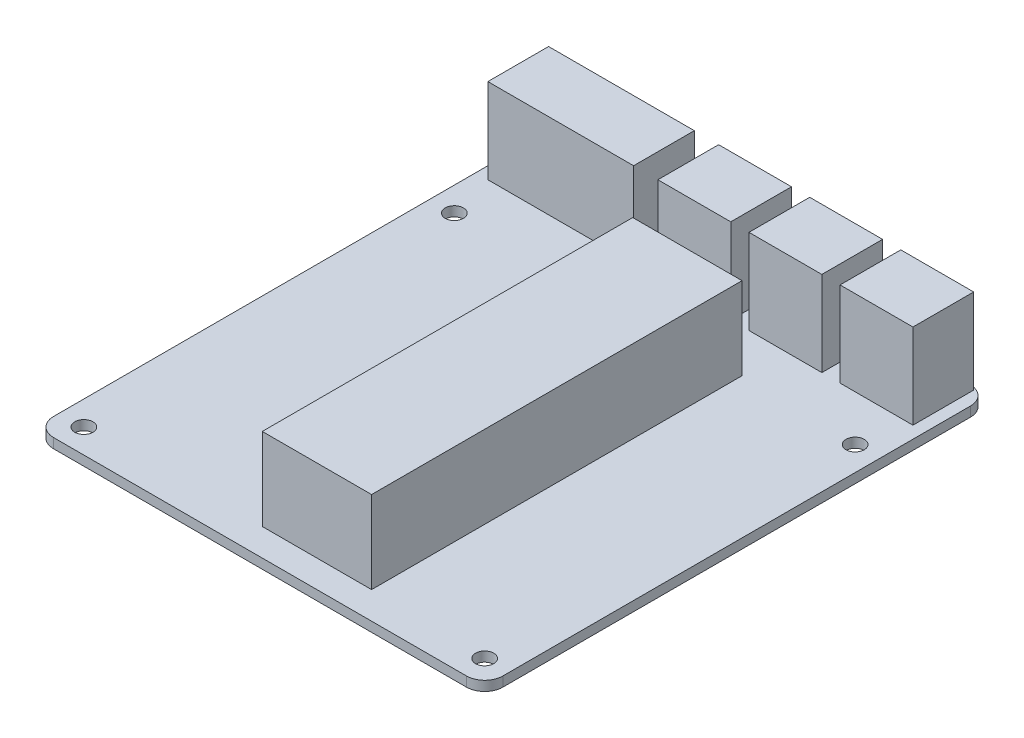
ISO-10303-21;
HEADER;
FILE_DESCRIPTION(('STEP AP214'),'2;1');
FILE_NAME('part.step','',(''),(''),'','','');
FILE_SCHEMA(('AUTOMOTIVE_DESIGN { 1 0 10303 214 1 1 1 1 }'));
ENDSEC;
DATA;
#1=APPLICATION_CONTEXT('core data for automotive mechanical design processes');
#2=APPLICATION_PROTOCOL_DEFINITION('international standard','automotive_design',2000,#1);
#3=PRODUCT_CONTEXT('',#1,'mechanical');
#4=PRODUCT('Part','Part','',(#3));
#5=PRODUCT_RELATED_PRODUCT_CATEGORY('part','',(#4));
#6=PRODUCT_DEFINITION_FORMATION('','',#4);
#7=PRODUCT_DEFINITION_CONTEXT('part definition',#1,'design');
#8=PRODUCT_DEFINITION('design','',#6,#7);
#9=PRODUCT_DEFINITION_SHAPE('','',#8);
#10=(LENGTH_UNIT() NAMED_UNIT(*) SI_UNIT(.MILLI.,.METRE.));
#11=(NAMED_UNIT(*) PLANE_ANGLE_UNIT() SI_UNIT($,.RADIAN.));
#12=(NAMED_UNIT(*) SI_UNIT($,.STERADIAN.) SOLID_ANGLE_UNIT());
#13=UNCERTAINTY_MEASURE_WITH_UNIT(LENGTH_MEASURE(1.E-05),#10,'distance_accuracy_value','');
#14=(GEOMETRIC_REPRESENTATION_CONTEXT(3) GLOBAL_UNCERTAINTY_ASSIGNED_CONTEXT((#13)) GLOBAL_UNIT_ASSIGNED_CONTEXT((#10,
#11,#12)) REPRESENTATION_CONTEXT('',''));
#15=CARTESIAN_POINT('',(0.,0.,0.));
#16=DIRECTION('',(0.,0.,1.));
#17=DIRECTION('',(1.,0.,0.));
#18=AXIS2_PLACEMENT_3D('',#15,#16,#17);
#19=CARTESIAN_POINT('',(-34.,1.6,-38.5));
#20=DIRECTION('',(0.,1.,0.));
#21=DIRECTION('',(0.,0.,1.));
#22=AXIS2_PLACEMENT_3D('',#19,#20,#21);
#23=PLANE('',#22);
#24=CARTESIAN_POINT('',(33.,1.6,-23.5));
#25=DIRECTION('',(0.,1.,0.));
#26=DIRECTION('',(0.,0.,1.));
#27=AXIS2_PLACEMENT_3D('',#24,#25,#26);
#28=CIRCLE('',#27,1.5);
#29=CARTESIAN_POINT('',(33.,1.6,-22.));
#30=VERTEX_POINT('',#29);
#31=EDGE_CURVE('E385',#30,#30,#28,.T.);
#32=ORIENTED_EDGE('',*,*,#31,.F.);
#33=EDGE_LOOP('',(#32));
#34=FACE_BOUND('',#33,.T.);
#35=CARTESIAN_POINT('',(-33.,1.6,37.5));
#36=DIRECTION('',(0.,1.,0.));
#37=DIRECTION('',(0.,0.,1.));
#38=AXIS2_PLACEMENT_3D('',#35,#36,#37);
#39=CIRCLE('',#38,1.5);
#40=CARTESIAN_POINT('',(-33.,1.6,39.));
#41=VERTEX_POINT('',#40);
#42=EDGE_CURVE('E382',#41,#41,#39,.T.);
#43=ORIENTED_EDGE('',*,*,#42,.F.);
#44=EDGE_LOOP('',(#43));
#45=FACE_BOUND('',#44,.T.);
#46=CARTESIAN_POINT('',(33.,1.6,37.5));
#47=DIRECTION('',(0.,1.,0.));
#48=DIRECTION('',(0.,0.,1.));
#49=AXIS2_PLACEMENT_3D('',#46,#47,#48);
#50=CIRCLE('',#49,1.5);
#51=CARTESIAN_POINT('',(33.,1.6,39.));
#52=VERTEX_POINT('',#51);
#53=EDGE_CURVE('E379',#52,#52,#50,.T.);
#54=ORIENTED_EDGE('',*,*,#53,.F.);
#55=EDGE_LOOP('',(#54));
#56=FACE_BOUND('',#55,.T.);
#57=CARTESIAN_POINT('',(-33.,1.6,-23.5));
#58=DIRECTION('',(0.,1.,0.));
#59=DIRECTION('',(0.,0.,1.));
#60=AXIS2_PLACEMENT_3D('',#57,#58,#59);
#61=CIRCLE('',#60,1.5);
#62=CARTESIAN_POINT('',(-33.,1.6,-22.));
#63=VERTEX_POINT('',#62);
#64=EDGE_CURVE('E376',#63,#63,#61,.T.);
#65=ORIENTED_EDGE('',*,*,#64,.F.);
#66=EDGE_LOOP('',(#65));
#67=FACE_BOUND('',#66,.T.);
#68=CARTESIAN_POINT('',(-34.,1.6,-38.5));
#69=DIRECTION('',(0.,1.,0.));
#70=DIRECTION('',(0.,0.,1.));
#71=AXIS2_PLACEMENT_3D('',#68,#69,#70);
#72=CIRCLE('',#71,3.);
#73=CARTESIAN_POINT('',(-34.,1.6,-41.5));
#74=VERTEX_POINT('',#73);
#75=CARTESIAN_POINT('',(-37.,1.6,-38.5));
#76=VERTEX_POINT('',#75);
#77=EDGE_CURVE('E389',#74,#76,#72,.T.);
#78=ORIENTED_EDGE('',*,*,#77,.T.);
#79=DIRECTION('',(0.,0.,1.));
#80=VECTOR('',#79,1.);
#81=CARTESIAN_POINT('',(-37.,1.6,-38.5));
#82=LINE('',#81,#80);
#83=CARTESIAN_POINT('',(-37.,1.6,38.5));
#84=VERTEX_POINT('',#83);
#85=EDGE_CURVE('E392',#76,#84,#82,.T.);
#86=ORIENTED_EDGE('',*,*,#85,.T.);
#87=CARTESIAN_POINT('',(-34.,1.6,38.5));
#88=DIRECTION('',(0.,1.,0.));
#89=DIRECTION('',(0.,0.,-1.));
#90=AXIS2_PLACEMENT_3D('',#87,#88,#89);
#91=CIRCLE('',#90,3.);
#92=CARTESIAN_POINT('',(-34.,1.6,41.5));
#93=VERTEX_POINT('',#92);
#94=EDGE_CURVE('E395',#84,#93,#91,.T.);
#95=ORIENTED_EDGE('',*,*,#94,.T.);
#96=DIRECTION('',(1.,0.,0.));
#97=VECTOR('',#96,1.);
#98=CARTESIAN_POINT('',(34.,1.6,41.5));
#99=LINE('',#98,#97);
#100=CARTESIAN_POINT('',(34.,1.6,41.5));
#101=VERTEX_POINT('',#100);
#102=EDGE_CURVE('E397',#93,#101,#99,.T.);
#103=ORIENTED_EDGE('',*,*,#102,.T.);
#104=CARTESIAN_POINT('',(34.,1.6,38.5));
#105=DIRECTION('',(0.,1.,0.));
#106=DIRECTION('',(0.,0.,-1.));
#107=AXIS2_PLACEMENT_3D('',#104,#105,#106);
#108=CIRCLE('',#107,3.);
#109=CARTESIAN_POINT('',(37.,1.6,38.5));
#110=VERTEX_POINT('',#109);
#111=EDGE_CURVE('E399',#101,#110,#108,.T.);
#112=ORIENTED_EDGE('',*,*,#111,.T.);
#113=DIRECTION('',(0.,0.,-1.));
#114=VECTOR('',#113,1.);
#115=CARTESIAN_POINT('',(37.,1.6,-38.5));
#116=LINE('',#115,#114);
#117=CARTESIAN_POINT('',(37.,1.6,-38.5));
#118=VERTEX_POINT('',#117);
#119=EDGE_CURVE('E401',#110,#118,#116,.T.);
#120=ORIENTED_EDGE('',*,*,#119,.T.);
#121=CARTESIAN_POINT('',(34.,1.6,-38.5));
#122=DIRECTION('',(0.,1.,0.));
#123=DIRECTION('',(0.,0.,-1.));
#124=AXIS2_PLACEMENT_3D('',#121,#122,#123);
#125=CIRCLE('',#124,3.);
#126=CARTESIAN_POINT('',(34.,1.6,-41.5));
#127=VERTEX_POINT('',#126);
#128=EDGE_CURVE('E403',#118,#127,#125,.T.);
#129=ORIENTED_EDGE('',*,*,#128,.T.);
#130=DIRECTION('',(-1.,0.,0.));
#131=VECTOR('',#130,1.);
#132=CARTESIAN_POINT('',(34.,1.6,-41.5));
#133=LINE('',#132,#131);
#134=EDGE_CURVE('E405',#127,#74,#133,.T.);
#135=ORIENTED_EDGE('',*,*,#134,.T.);
#136=EDGE_LOOP('',(#78,#86,#95,#103,#112,#120,#129,#135));
#137=FACE_BOUND('',#136,.T.);
#138=DIRECTION('',(1.,0.,0.));
#139=VECTOR('',#138,1.);
#140=CARTESIAN_POINT('',(-11.,1.6,-31.0223671871747));
#141=LINE('',#140,#139);
#142=CARTESIAN_POINT('',(-35.,1.6,-31.0223671871747));
#143=VERTEX_POINT('',#142);
#144=CARTESIAN_POINT('',(-11.,1.6,-31.0223671871747));
#145=VERTEX_POINT('',#144);
#146=EDGE_CURVE('E349',#143,#145,#141,.T.);
#147=ORIENTED_EDGE('',*,*,#146,.F.);
#148=DIRECTION('',(0.,0.,1.));
#149=VECTOR('',#148,1.);
#150=CARTESIAN_POINT('',(-35.,1.6,-41.0223671871747));
#151=LINE('',#150,#149);
#152=CARTESIAN_POINT('',(-35.,1.6,-41.0223671871747));
#153=VERTEX_POINT('',#152);
#154=EDGE_CURVE('E335',#153,#143,#151,.T.);
#155=ORIENTED_EDGE('',*,*,#154,.F.);
#156=DIRECTION('',(-1.,0.,0.));
#157=VECTOR('',#156,1.);
#158=CARTESIAN_POINT('',(-11.,1.6,-41.0223671871747));
#159=LINE('',#158,#157);
#160=CARTESIAN_POINT('',(-11.,1.6,-41.0223671871747));
#161=VERTEX_POINT('',#160);
#162=EDGE_CURVE('E340',#161,#153,#159,.T.);
#163=ORIENTED_EDGE('',*,*,#162,.F.);
#164=DIRECTION('',(0.,0.,-1.));
#165=VECTOR('',#164,1.);
#166=CARTESIAN_POINT('',(-11.,1.6,-41.0223671871747));
#167=LINE('',#166,#165);
#168=EDGE_CURVE('E351',#145,#161,#167,.T.);
#169=ORIENTED_EDGE('',*,*,#168,.F.);
#170=EDGE_LOOP('',(#147,#155,#163,#169));
#171=FACE_BOUND('',#170,.T.);
#172=DIRECTION('',(1.,0.,0.));
#173=VECTOR('',#172,1.);
#174=CARTESIAN_POINT('',(5.,1.6,-31.0223671871747));
#175=LINE('',#174,#173);
#176=CARTESIAN_POINT('',(-7.,1.6,-31.0223671871747));
#177=VERTEX_POINT('',#176);
#178=CARTESIAN_POINT('',(5.,1.6,-31.0223671871747));
#179=VERTEX_POINT('',#178);
#180=EDGE_CURVE('E320',#177,#179,#175,.T.);
#181=ORIENTED_EDGE('',*,*,#180,.F.);
#182=DIRECTION('',(0.,0.,1.));
#183=VECTOR('',#182,1.);
#184=CARTESIAN_POINT('',(-7.,1.6,-41.0223671871747));
#185=LINE('',#184,#183);
#186=CARTESIAN_POINT('',(-7.,1.6,-41.0223671871747));
#187=VERTEX_POINT('',#186);
#188=EDGE_CURVE('E306',#187,#177,#185,.T.);
#189=ORIENTED_EDGE('',*,*,#188,.F.);
#190=DIRECTION('',(-1.,0.,0.));
#191=VECTOR('',#190,1.);
#192=CARTESIAN_POINT('',(5.,1.6,-41.0223671871747));
#193=LINE('',#192,#191);
#194=CARTESIAN_POINT('',(5.,1.6,-41.0223671871747));
#195=VERTEX_POINT('',#194);
#196=EDGE_CURVE('E311',#195,#187,#193,.T.);
#197=ORIENTED_EDGE('',*,*,#196,.F.);
#198=DIRECTION('',(0.,0.,-1.));
#199=VECTOR('',#198,1.);
#200=CARTESIAN_POINT('',(5.,1.6,-41.0223671871747));
#201=LINE('',#200,#199);
#202=EDGE_CURVE('E322',#179,#195,#201,.T.);
#203=ORIENTED_EDGE('',*,*,#202,.F.);
#204=EDGE_LOOP('',(#181,#189,#197,#203));
#205=FACE_BOUND('',#204,.T.);
#206=DIRECTION('',(1.,0.,0.));
#207=VECTOR('',#206,1.);
#208=CARTESIAN_POINT('',(20.,1.6,-31.0223671871747));
#209=LINE('',#208,#207);
#210=CARTESIAN_POINT('',(8.,1.6,-31.0223671871747));
#211=VERTEX_POINT('',#210);
#212=CARTESIAN_POINT('',(20.,1.6,-31.0223671871747));
#213=VERTEX_POINT('',#212);
#214=EDGE_CURVE('E291',#211,#213,#209,.T.);
#215=ORIENTED_EDGE('',*,*,#214,.F.);
#216=DIRECTION('',(0.,0.,1.));
#217=VECTOR('',#216,1.);
#218=CARTESIAN_POINT('',(8.,1.6,-41.0223671871747));
#219=LINE('',#218,#217);
#220=CARTESIAN_POINT('',(8.,1.6,-41.0223671871747));
#221=VERTEX_POINT('',#220);
#222=EDGE_CURVE('E277',#221,#211,#219,.T.);
#223=ORIENTED_EDGE('',*,*,#222,.F.);
#224=DIRECTION('',(-1.,0.,0.));
#225=VECTOR('',#224,1.);
#226=CARTESIAN_POINT('',(20.,1.6,-41.0223671871747));
#227=LINE('',#226,#225);
#228=CARTESIAN_POINT('',(20.,1.6,-41.0223671871747));
#229=VERTEX_POINT('',#228);
#230=EDGE_CURVE('E282',#229,#221,#227,.T.);
#231=ORIENTED_EDGE('',*,*,#230,.F.);
#232=DIRECTION('',(0.,0.,-1.));
#233=VECTOR('',#232,1.);
#234=CARTESIAN_POINT('',(20.,1.6,-41.0223671871747));
#235=LINE('',#234,#233);
#236=EDGE_CURVE('E293',#213,#229,#235,.T.);
#237=ORIENTED_EDGE('',*,*,#236,.F.);
#238=EDGE_LOOP('',(#215,#223,#231,#237));
#239=FACE_BOUND('',#238,.T.);
#240=DIRECTION('',(1.,0.,0.));
#241=VECTOR('',#240,1.);
#242=CARTESIAN_POINT('',(35.,1.6,-31.0223671871747));
#243=LINE('',#242,#241);
#244=CARTESIAN_POINT('',(23.,1.6,-31.0223671871747));
#245=VERTEX_POINT('',#244);
#246=CARTESIAN_POINT('',(35.,1.6,-31.0223671871747));
#247=VERTEX_POINT('',#246);
#248=EDGE_CURVE('E249',#245,#247,#243,.T.);
#249=ORIENTED_EDGE('',*,*,#248,.F.);
#250=DIRECTION('',(0.,0.,1.));
#251=VECTOR('',#250,1.);
#252=CARTESIAN_POINT('',(23.,1.6,-41.0223671871747));
#253=LINE('',#252,#251);
#254=CARTESIAN_POINT('',(23.,1.6,-41.0223671871747));
#255=VERTEX_POINT('',#254);
#256=EDGE_CURVE('E246',#255,#245,#253,.T.);
#257=ORIENTED_EDGE('',*,*,#256,.F.);
#258=DIRECTION('',(-1.,0.,0.));
#259=VECTOR('',#258,1.);
#260=CARTESIAN_POINT('',(35.,1.6,-41.0223671871747));
#261=LINE('',#260,#259);
#262=CARTESIAN_POINT('',(35.,1.6,-41.0223671871747));
#263=VERTEX_POINT('',#262);
#264=EDGE_CURVE('E258',#263,#255,#261,.T.);
#265=ORIENTED_EDGE('',*,*,#264,.F.);
#266=DIRECTION('',(0.,0.,-1.));
#267=VECTOR('',#266,1.);
#268=CARTESIAN_POINT('',(35.,1.6,-41.0223671871747));
#269=LINE('',#268,#267);
#270=EDGE_CURVE('E266',#247,#263,#269,.T.);
#271=ORIENTED_EDGE('',*,*,#270,.F.);
#272=EDGE_LOOP('',(#249,#257,#265,#271));
#273=FACE_BOUND('',#272,.T.);
#274=DIRECTION('',(1.,0.,0.));
#275=VECTOR('',#274,1.);
#276=CARTESIAN_POINT('',(13.88,1.6,37.));
#277=LINE('',#276,#275);
#278=CARTESIAN_POINT('',(-4.11999999999999,1.6,37.));
#279=VERTEX_POINT('',#278);
#280=CARTESIAN_POINT('',(13.88,1.6,37.));
#281=VERTEX_POINT('',#280);
#282=EDGE_CURVE('E852',#279,#281,#277,.T.);
#283=ORIENTED_EDGE('',*,*,#282,.F.);
#284=DIRECTION('',(0.,0.,1.));
#285=VECTOR('',#284,1.);
#286=CARTESIAN_POINT('',(-4.12,1.6,-24.));
#287=LINE('',#286,#285);
#288=CARTESIAN_POINT('',(-4.12,1.6,-24.));
#289=VERTEX_POINT('',#288);
#290=EDGE_CURVE('E244',#289,#279,#287,.T.);
#291=ORIENTED_EDGE('',*,*,#290,.F.);
#292=DIRECTION('',(-1.,0.,0.));
#293=VECTOR('',#292,1.);
#294=CARTESIAN_POINT('',(13.88,1.6,-24.));
#295=LINE('',#294,#293);
#296=CARTESIAN_POINT('',(13.88,1.6,-24.));
#297=VERTEX_POINT('',#296);
#298=EDGE_CURVE('E240',#297,#289,#295,.T.);
#299=ORIENTED_EDGE('',*,*,#298,.F.);
#300=DIRECTION('',(0.,0.,-1.));
#301=VECTOR('',#300,1.);
#302=CARTESIAN_POINT('',(13.88,1.6,-24.));
#303=LINE('',#302,#301);
#304=EDGE_CURVE('E849',#281,#297,#303,.T.);
#305=ORIENTED_EDGE('',*,*,#304,.F.);
#306=EDGE_LOOP('',(#283,#291,#299,#305));
#307=FACE_BOUND('',#306,.T.);
#308=ADVANCED_FACE('F35',(#34,#45,#56,#67,#137,#171,#205,#239,#273,#307),#23,.T.);
#309=CARTESIAN_POINT('',(-34.,1.6,-38.5));
#310=DIRECTION('',(0.,-1.,0.));
#311=DIRECTION('',(0.,0.,-1.));
#312=AXIS2_PLACEMENT_3D('',#309,#310,#311);
#313=CYLINDRICAL_SURFACE('',#312,3.);
#314=CARTESIAN_POINT('',(-34.,0.,-38.5));
#315=DIRECTION('',(0.,1.,0.));
#316=DIRECTION('',(0.,0.,1.));
#317=AXIS2_PLACEMENT_3D('',#314,#315,#316);
#318=CIRCLE('',#317,3.);
#319=CARTESIAN_POINT('',(-34.,0.,-41.5));
#320=VERTEX_POINT('',#319);
#321=CARTESIAN_POINT('',(-37.,0.,-38.5));
#322=VERTEX_POINT('',#321);
#323=EDGE_CURVE('E388',#320,#322,#318,.T.);
#324=ORIENTED_EDGE('',*,*,#323,.T.);
#325=DIRECTION('',(0.,-1.,0.));
#326=VECTOR('',#325,1.);
#327=CARTESIAN_POINT('',(-37.,1.6,-38.5));
#328=LINE('',#327,#326);
#329=EDGE_CURVE('E11',#76,#322,#328,.T.);
#330=ORIENTED_EDGE('',*,*,#329,.F.);
#331=ORIENTED_EDGE('',*,*,#77,.F.);
#332=DIRECTION('',(0.,-1.,0.));
#333=VECTOR('',#332,1.);
#334=CARTESIAN_POINT('',(-34.,1.6,-41.5));
#335=LINE('',#334,#333);
#336=EDGE_CURVE('E407',#74,#320,#335,.T.);
#337=ORIENTED_EDGE('',*,*,#336,.T.);
#338=EDGE_LOOP('',(#324,#330,#331,#337));
#339=FACE_BOUND('',#338,.T.);
#340=ADVANCED_FACE('F37',(#339),#313,.T.);
#341=CARTESIAN_POINT('',(-37.,1.6,-38.5));
#342=DIRECTION('',(1.,0.,0.));
#343=DIRECTION('',(0.,0.,-1.));
#344=AXIS2_PLACEMENT_3D('',#341,#342,#343);
#345=PLANE('',#344);
#346=DIRECTION('',(0.,0.,1.));
#347=VECTOR('',#346,1.);
#348=CARTESIAN_POINT('',(-37.,0.,-38.5));
#349=LINE('',#348,#347);
#350=CARTESIAN_POINT('',(-37.,0.,38.5));
#351=VERTEX_POINT('',#350);
#352=EDGE_CURVE('E410',#322,#351,#349,.T.);
#353=ORIENTED_EDGE('',*,*,#352,.T.);
#354=DIRECTION('',(0.,-1.,0.));
#355=VECTOR('',#354,1.);
#356=CARTESIAN_POINT('',(-37.,1.6,38.5));
#357=LINE('',#356,#355);
#358=EDGE_CURVE('E43',#84,#351,#357,.T.);
#359=ORIENTED_EDGE('',*,*,#358,.F.);
#360=ORIENTED_EDGE('',*,*,#85,.F.);
#361=ORIENTED_EDGE('',*,*,#329,.T.);
#362=EDGE_LOOP('',(#353,#359,#360,#361));
#363=FACE_BOUND('',#362,.T.);
#364=ADVANCED_FACE('F467',(#363),#345,.F.);
#365=CARTESIAN_POINT('',(-34.,1.6,38.5));
#366=DIRECTION('',(0.,-1.,0.));
#367=DIRECTION('',(0.,0.,-1.));
#368=AXIS2_PLACEMENT_3D('',#365,#366,#367);
#369=CYLINDRICAL_SURFACE('',#368,3.);
#370=CARTESIAN_POINT('',(-34.,0.,38.5));
#371=DIRECTION('',(0.,1.,0.));
#372=DIRECTION('',(0.,0.,-1.));
#373=AXIS2_PLACEMENT_3D('',#370,#371,#372);
#374=CIRCLE('',#373,3.);
#375=CARTESIAN_POINT('',(-34.,0.,41.5));
#376=VERTEX_POINT('',#375);
#377=EDGE_CURVE('E412',#351,#376,#374,.T.);
#378=ORIENTED_EDGE('',*,*,#377,.T.);
#379=DIRECTION('',(0.,-1.,0.));
#380=VECTOR('',#379,1.);
#381=CARTESIAN_POINT('',(-34.,1.6,41.5));
#382=LINE('',#381,#380);
#383=EDGE_CURVE('E437',#93,#376,#382,.T.);
#384=ORIENTED_EDGE('',*,*,#383,.F.);
#385=ORIENTED_EDGE('',*,*,#94,.F.);
#386=ORIENTED_EDGE('',*,*,#358,.T.);
#387=EDGE_LOOP('',(#378,#384,#385,#386));
#388=FACE_BOUND('',#387,.T.);
#389=ADVANCED_FACE('F444',(#388),#369,.T.);
#390=CARTESIAN_POINT('',(34.,1.6,41.5));
#391=DIRECTION('',(0.,0.,-1.));
#392=DIRECTION('',(-1.,0.,0.));
#393=AXIS2_PLACEMENT_3D('',#390,#391,#392);
#394=PLANE('',#393);
#395=DIRECTION('',(1.,0.,0.));
#396=VECTOR('',#395,1.);
#397=CARTESIAN_POINT('',(34.,0.,41.5));
#398=LINE('',#397,#396);
#399=CARTESIAN_POINT('',(34.,0.,41.5));
#400=VERTEX_POINT('',#399);
#401=EDGE_CURVE('E414',#376,#400,#398,.T.);
#402=ORIENTED_EDGE('',*,*,#401,.T.);
#403=DIRECTION('',(0.,-1.,0.));
#404=VECTOR('',#403,1.);
#405=CARTESIAN_POINT('',(34.,1.6,41.5));
#406=LINE('',#405,#404);
#407=EDGE_CURVE('E434',#101,#400,#406,.T.);
#408=ORIENTED_EDGE('',*,*,#407,.F.);
#409=ORIENTED_EDGE('',*,*,#102,.F.);
#410=ORIENTED_EDGE('',*,*,#383,.T.);
#411=EDGE_LOOP('',(#402,#408,#409,#410));
#412=FACE_BOUND('',#411,.T.);
#413=ADVANCED_FACE('F455',(#412),#394,.F.);
#414=CARTESIAN_POINT('',(34.,1.6,38.5));
#415=DIRECTION('',(0.,-1.,0.));
#416=DIRECTION('',(0.,0.,-1.));
#417=AXIS2_PLACEMENT_3D('',#414,#415,#416);
#418=CYLINDRICAL_SURFACE('',#417,3.);
#419=CARTESIAN_POINT('',(34.,0.,38.5));
#420=DIRECTION('',(0.,1.,0.));
#421=DIRECTION('',(0.,0.,-1.));
#422=AXIS2_PLACEMENT_3D('',#419,#420,#421);
#423=CIRCLE('',#422,3.);
#424=CARTESIAN_POINT('',(37.,0.,38.5));
#425=VERTEX_POINT('',#424);
#426=EDGE_CURVE('E416',#400,#425,#423,.T.);
#427=ORIENTED_EDGE('',*,*,#426,.T.);
#428=DIRECTION('',(0.,-1.,0.));
#429=VECTOR('',#428,1.);
#430=CARTESIAN_POINT('',(37.,1.6,38.5));
#431=LINE('',#430,#429);
#432=EDGE_CURVE('E431',#110,#425,#431,.T.);
#433=ORIENTED_EDGE('',*,*,#432,.F.);
#434=ORIENTED_EDGE('',*,*,#111,.F.);
#435=ORIENTED_EDGE('',*,*,#407,.T.);
#436=EDGE_LOOP('',(#427,#433,#434,#435));
#437=FACE_BOUND('',#436,.T.);
#438=ADVANCED_FACE('F459',(#437),#418,.T.);
#439=CARTESIAN_POINT('',(37.,1.6,-38.5));
#440=DIRECTION('',(-1.,0.,0.));
#441=DIRECTION('',(0.,0.,1.));
#442=AXIS2_PLACEMENT_3D('',#439,#440,#441);
#443=PLANE('',#442);
#444=DIRECTION('',(0.,0.,-1.));
#445=VECTOR('',#444,1.);
#446=CARTESIAN_POINT('',(37.,0.,-38.5));
#447=LINE('',#446,#445);
#448=CARTESIAN_POINT('',(37.,0.,-38.5));
#449=VERTEX_POINT('',#448);
#450=EDGE_CURVE('E418',#425,#449,#447,.T.);
#451=ORIENTED_EDGE('',*,*,#450,.T.);
#452=DIRECTION('',(0.,-1.,0.));
#453=VECTOR('',#452,1.);
#454=CARTESIAN_POINT('',(37.,1.6,-38.5));
#455=LINE('',#454,#453);
#456=EDGE_CURVE('E428',#118,#449,#455,.T.);
#457=ORIENTED_EDGE('',*,*,#456,.F.);
#458=ORIENTED_EDGE('',*,*,#119,.F.);
#459=ORIENTED_EDGE('',*,*,#432,.T.);
#460=EDGE_LOOP('',(#451,#457,#458,#459));
#461=FACE_BOUND('',#460,.T.);
#462=ADVANCED_FACE('F480',(#461),#443,.F.);
#463=CARTESIAN_POINT('',(34.,1.6,-38.5));
#464=DIRECTION('',(0.,-1.,0.));
#465=DIRECTION('',(0.,0.,-1.));
#466=AXIS2_PLACEMENT_3D('',#463,#464,#465);
#467=CYLINDRICAL_SURFACE('',#466,3.);
#468=CARTESIAN_POINT('',(34.,0.,-38.5));
#469=DIRECTION('',(0.,1.,0.));
#470=DIRECTION('',(0.,0.,-1.));
#471=AXIS2_PLACEMENT_3D('',#468,#469,#470);
#472=CIRCLE('',#471,3.);
#473=CARTESIAN_POINT('',(34.,0.,-41.5));
#474=VERTEX_POINT('',#473);
#475=EDGE_CURVE('E420',#449,#474,#472,.T.);
#476=ORIENTED_EDGE('',*,*,#475,.T.);
#477=DIRECTION('',(0.,-1.,0.));
#478=VECTOR('',#477,1.);
#479=CARTESIAN_POINT('',(34.,1.6,-41.5));
#480=LINE('',#479,#478);
#481=EDGE_CURVE('E425',#127,#474,#480,.T.);
#482=ORIENTED_EDGE('',*,*,#481,.F.);
#483=ORIENTED_EDGE('',*,*,#128,.F.);
#484=ORIENTED_EDGE('',*,*,#456,.T.);
#485=EDGE_LOOP('',(#476,#482,#483,#484));
#486=FACE_BOUND('',#485,.T.);
#487=ADVANCED_FACE('F478',(#486),#467,.T.);
#488=CARTESIAN_POINT('',(34.,1.6,-41.5));
#489=DIRECTION('',(0.,0.,1.));
#490=DIRECTION('',(1.,0.,0.));
#491=AXIS2_PLACEMENT_3D('',#488,#489,#490);
#492=PLANE('',#491);
#493=DIRECTION('',(-1.,0.,0.));
#494=VECTOR('',#493,1.);
#495=CARTESIAN_POINT('',(34.,0.,-41.5));
#496=LINE('',#495,#494);
#497=EDGE_CURVE('E393',#474,#320,#496,.T.);
#498=ORIENTED_EDGE('',*,*,#497,.T.);
#499=ORIENTED_EDGE('',*,*,#336,.F.);
#500=ORIENTED_EDGE('',*,*,#134,.F.);
#501=ORIENTED_EDGE('',*,*,#481,.T.);
#502=EDGE_LOOP('',(#498,#499,#500,#501));
#503=FACE_BOUND('',#502,.T.);
#504=ADVANCED_FACE('F473',(#503),#492,.F.);
#505=CARTESIAN_POINT('',(-34.,0.,-38.5));
#506=DIRECTION('',(0.,1.,0.));
#507=DIRECTION('',(0.,0.,1.));
#508=AXIS2_PLACEMENT_3D('',#505,#506,#507);
#509=PLANE('',#508);
#510=CARTESIAN_POINT('',(33.,0.,-23.5));
#511=DIRECTION('',(0.,1.,0.));
#512=DIRECTION('',(0.,0.,1.));
#513=AXIS2_PLACEMENT_3D('',#510,#511,#512);
#514=CIRCLE('',#513,1.5);
#515=CARTESIAN_POINT('',(33.,0.,-22.));
#516=VERTEX_POINT('',#515);
#517=EDGE_CURVE('E368',#516,#516,#514,.T.);
#518=ORIENTED_EDGE('',*,*,#517,.T.);
#519=EDGE_LOOP('',(#518));
#520=FACE_BOUND('',#519,.T.);
#521=CARTESIAN_POINT('',(-33.,0.,37.5));
#522=DIRECTION('',(0.,1.,0.));
#523=DIRECTION('',(0.,0.,1.));
#524=AXIS2_PLACEMENT_3D('',#521,#522,#523);
#525=CIRCLE('',#524,1.5);
#526=CARTESIAN_POINT('',(-33.,0.,39.));
#527=VERTEX_POINT('',#526);
#528=EDGE_CURVE('E367',#527,#527,#525,.T.);
#529=ORIENTED_EDGE('',*,*,#528,.T.);
#530=EDGE_LOOP('',(#529));
#531=FACE_BOUND('',#530,.T.);
#532=CARTESIAN_POINT('',(33.,0.,37.5));
#533=DIRECTION('',(0.,1.,0.));
#534=DIRECTION('',(0.,0.,1.));
#535=AXIS2_PLACEMENT_3D('',#532,#533,#534);
#536=CIRCLE('',#535,1.5);
#537=CARTESIAN_POINT('',(33.,0.,39.));
#538=VERTEX_POINT('',#537);
#539=EDGE_CURVE('E364',#538,#538,#536,.T.);
#540=ORIENTED_EDGE('',*,*,#539,.T.);
#541=EDGE_LOOP('',(#540));
#542=FACE_BOUND('',#541,.T.);
#543=CARTESIAN_POINT('',(-33.,0.,-23.5));
#544=DIRECTION('',(0.,1.,0.));
#545=DIRECTION('',(0.,0.,1.));
#546=AXIS2_PLACEMENT_3D('',#543,#544,#545);
#547=CIRCLE('',#546,1.5);
#548=CARTESIAN_POINT('',(-33.,0.,-22.));
#549=VERTEX_POINT('',#548);
#550=EDGE_CURVE('E371',#549,#549,#547,.T.);
#551=ORIENTED_EDGE('',*,*,#550,.T.);
#552=EDGE_LOOP('',(#551));
#553=FACE_BOUND('',#552,.T.);
#554=ORIENTED_EDGE('',*,*,#323,.F.);
#555=ORIENTED_EDGE('',*,*,#497,.F.);
#556=ORIENTED_EDGE('',*,*,#475,.F.);
#557=ORIENTED_EDGE('',*,*,#450,.F.);
#558=ORIENTED_EDGE('',*,*,#426,.F.);
#559=ORIENTED_EDGE('',*,*,#401,.F.);
#560=ORIENTED_EDGE('',*,*,#377,.F.);
#561=ORIENTED_EDGE('',*,*,#352,.F.);
#562=EDGE_LOOP('',(#554,#555,#556,#557,#558,#559,#560,#561));
#563=FACE_BOUND('',#562,.T.);
#564=ADVANCED_FACE('F450',(#520,#531,#542,#553,#563),#509,.F.);
#565=CARTESIAN_POINT('',(-33.,0.,-23.5));
#566=DIRECTION('',(0.,1.,0.));
#567=DIRECTION('',(0.,0.,1.));
#568=AXIS2_PLACEMENT_3D('',#565,#566,#567);
#569=CYLINDRICAL_SURFACE('',#568,1.5);
#570=ORIENTED_EDGE('',*,*,#64,.T.);
#571=EDGE_LOOP('',(#570));
#572=FACE_BOUND('',#571,.T.);
#573=ORIENTED_EDGE('',*,*,#550,.F.);
#574=EDGE_LOOP('',(#573));
#575=FACE_BOUND('',#574,.T.);
#576=ADVANCED_FACE('F499',(#572,#575),#569,.F.);
#577=CARTESIAN_POINT('',(33.,0.,37.5));
#578=DIRECTION('',(0.,1.,0.));
#579=DIRECTION('',(0.,0.,1.));
#580=AXIS2_PLACEMENT_3D('',#577,#578,#579);
#581=CYLINDRICAL_SURFACE('',#580,1.5);
#582=ORIENTED_EDGE('',*,*,#53,.T.);
#583=EDGE_LOOP('',(#582));
#584=FACE_BOUND('',#583,.T.);
#585=ORIENTED_EDGE('',*,*,#539,.F.);
#586=EDGE_LOOP('',(#585));
#587=FACE_BOUND('',#586,.T.);
#588=ADVANCED_FACE('F519',(#584,#587),#581,.F.);
#589=CARTESIAN_POINT('',(-33.,0.,37.5));
#590=DIRECTION('',(0.,1.,0.));
#591=DIRECTION('',(0.,0.,1.));
#592=AXIS2_PLACEMENT_3D('',#589,#590,#591);
#593=CYLINDRICAL_SURFACE('',#592,1.5);
#594=ORIENTED_EDGE('',*,*,#42,.T.);
#595=EDGE_LOOP('',(#594));
#596=FACE_BOUND('',#595,.T.);
#597=ORIENTED_EDGE('',*,*,#528,.F.);
#598=EDGE_LOOP('',(#597));
#599=FACE_BOUND('',#598,.T.);
#600=ADVANCED_FACE('F526',(#596,#599),#593,.F.);
#601=CARTESIAN_POINT('',(33.,0.,-23.5));
#602=DIRECTION('',(0.,1.,0.));
#603=DIRECTION('',(0.,0.,1.));
#604=AXIS2_PLACEMENT_3D('',#601,#602,#603);
#605=CYLINDRICAL_SURFACE('',#604,1.5);
#606=ORIENTED_EDGE('',*,*,#31,.T.);
#607=EDGE_LOOP('',(#606));
#608=FACE_BOUND('',#607,.T.);
#609=ORIENTED_EDGE('',*,*,#517,.F.);
#610=EDGE_LOOP('',(#609));
#611=FACE_BOUND('',#610,.T.);
#612=ADVANCED_FACE('F534',(#608,#611),#605,.F.);
#613=CARTESIAN_POINT('',(-35.,15.6,-41.0223671871747));
#614=DIRECTION('',(1.,0.,0.));
#615=DIRECTION('',(0.,0.,-1.));
#616=AXIS2_PLACEMENT_3D('',#613,#614,#615);
#617=PLANE('',#616);
#618=ORIENTED_EDGE('',*,*,#154,.T.);
#619=DIRECTION('',(0.,-1.,0.));
#620=VECTOR('',#619,1.);
#621=CARTESIAN_POINT('',(-35.,15.6,-31.0223671871747));
#622=LINE('',#621,#620);
#623=CARTESIAN_POINT('',(-35.,15.6,-31.0223671871747));
#624=VERTEX_POINT('',#623);
#625=EDGE_CURVE('E362',#624,#143,#622,.T.);
#626=ORIENTED_EDGE('',*,*,#625,.F.);
#627=DIRECTION('',(0.,0.,1.));
#628=VECTOR('',#627,1.);
#629=CARTESIAN_POINT('',(-35.,15.6,-41.0223671871747));
#630=LINE('',#629,#628);
#631=CARTESIAN_POINT('',(-35.,15.6,-41.0223671871747));
#632=VERTEX_POINT('',#631);
#633=EDGE_CURVE('E336',#632,#624,#630,.T.);
#634=ORIENTED_EDGE('',*,*,#633,.F.);
#635=DIRECTION('',(0.,-1.,0.));
#636=VECTOR('',#635,1.);
#637=CARTESIAN_POINT('',(-35.,15.6,-41.0223671871747));
#638=LINE('',#637,#636);
#639=EDGE_CURVE('E346',#632,#153,#638,.T.);
#640=ORIENTED_EDGE('',*,*,#639,.T.);
#641=EDGE_LOOP('',(#618,#626,#634,#640));
#642=FACE_BOUND('',#641,.T.);
#643=ADVANCED_FACE('F541',(#642),#617,.F.);
#644=CARTESIAN_POINT('',(-11.,15.6,-31.0223671871747));
#645=DIRECTION('',(0.,0.,-1.));
#646=DIRECTION('',(-1.,0.,0.));
#647=AXIS2_PLACEMENT_3D('',#644,#645,#646);
#648=PLANE('',#647);
#649=ORIENTED_EDGE('',*,*,#146,.T.);
#650=DIRECTION('',(0.,-1.,0.));
#651=VECTOR('',#650,1.);
#652=CARTESIAN_POINT('',(-11.,15.6,-31.0223671871747));
#653=LINE('',#652,#651);
#654=CARTESIAN_POINT('',(-11.,15.6,-31.0223671871747));
#655=VERTEX_POINT('',#654);
#656=EDGE_CURVE('E359',#655,#145,#653,.T.);
#657=ORIENTED_EDGE('',*,*,#656,.F.);
#658=DIRECTION('',(1.,0.,0.));
#659=VECTOR('',#658,1.);
#660=CARTESIAN_POINT('',(-11.,15.6,-31.0223671871747));
#661=LINE('',#660,#659);
#662=EDGE_CURVE('E339',#624,#655,#661,.T.);
#663=ORIENTED_EDGE('',*,*,#662,.F.);
#664=ORIENTED_EDGE('',*,*,#625,.T.);
#665=EDGE_LOOP('',(#649,#657,#663,#664));
#666=FACE_BOUND('',#665,.T.);
#667=ADVANCED_FACE('F549',(#666),#648,.F.);
#668=CARTESIAN_POINT('',(-11.,15.6,-41.0223671871747));
#669=DIRECTION('',(-1.,0.,0.));
#670=DIRECTION('',(0.,0.,1.));
#671=AXIS2_PLACEMENT_3D('',#668,#669,#670);
#672=PLANE('',#671);
#673=ORIENTED_EDGE('',*,*,#168,.T.);
#674=DIRECTION('',(0.,-1.,0.));
#675=VECTOR('',#674,1.);
#676=CARTESIAN_POINT('',(-11.,15.6,-41.0223671871747));
#677=LINE('',#676,#675);
#678=CARTESIAN_POINT('',(-11.,15.6,-41.0223671871747));
#679=VERTEX_POINT('',#678);
#680=EDGE_CURVE('E357',#679,#161,#677,.T.);
#681=ORIENTED_EDGE('',*,*,#680,.F.);
#682=DIRECTION('',(0.,0.,-1.));
#683=VECTOR('',#682,1.);
#684=CARTESIAN_POINT('',(-11.,15.6,-41.0223671871747));
#685=LINE('',#684,#683);
#686=EDGE_CURVE('E342',#655,#679,#685,.T.);
#687=ORIENTED_EDGE('',*,*,#686,.F.);
#688=ORIENTED_EDGE('',*,*,#656,.T.);
#689=EDGE_LOOP('',(#673,#681,#687,#688));
#690=FACE_BOUND('',#689,.T.);
#691=ADVANCED_FACE('F557',(#690),#672,.F.);
#692=CARTESIAN_POINT('',(-11.,15.6,-41.0223671871747));
#693=DIRECTION('',(0.,0.,1.));
#694=DIRECTION('',(1.,0.,0.));
#695=AXIS2_PLACEMENT_3D('',#692,#693,#694);
#696=PLANE('',#695);
#697=ORIENTED_EDGE('',*,*,#162,.T.);
#698=ORIENTED_EDGE('',*,*,#639,.F.);
#699=DIRECTION('',(-1.,0.,0.));
#700=VECTOR('',#699,1.);
#701=CARTESIAN_POINT('',(-11.,15.6,-41.0223671871747));
#702=LINE('',#701,#700);
#703=EDGE_CURVE('E344',#679,#632,#702,.T.);
#704=ORIENTED_EDGE('',*,*,#703,.F.);
#705=ORIENTED_EDGE('',*,*,#680,.T.);
#706=EDGE_LOOP('',(#697,#698,#704,#705));
#707=FACE_BOUND('',#706,.T.);
#708=ADVANCED_FACE('F565',(#707),#696,.F.);
#709=CARTESIAN_POINT('',(0.,15.6,0.));
#710=DIRECTION('',(0.,-1.,0.));
#711=DIRECTION('',(0.,0.,-1.));
#712=AXIS2_PLACEMENT_3D('',#709,#710,#711);
#713=PLANE('',#712);
#714=ORIENTED_EDGE('',*,*,#633,.T.);
#715=ORIENTED_EDGE('',*,*,#662,.T.);
#716=ORIENTED_EDGE('',*,*,#686,.T.);
#717=ORIENTED_EDGE('',*,*,#703,.T.);
#718=EDGE_LOOP('',(#714,#715,#716,#717));
#719=FACE_BOUND('',#718,.T.);
#720=ADVANCED_FACE('F573',(#719),#713,.F.);
#721=CARTESIAN_POINT('',(-7.,15.6,-41.0223671871747));
#722=DIRECTION('',(1.,0.,0.));
#723=DIRECTION('',(0.,0.,-1.));
#724=AXIS2_PLACEMENT_3D('',#721,#722,#723);
#725=PLANE('',#724);
#726=ORIENTED_EDGE('',*,*,#188,.T.);
#727=DIRECTION('',(0.,-1.,0.));
#728=VECTOR('',#727,1.);
#729=CARTESIAN_POINT('',(-7.,15.6,-31.0223671871747));
#730=LINE('',#729,#728);
#731=CARTESIAN_POINT('',(-7.,15.6,-31.0223671871747));
#732=VERTEX_POINT('',#731);
#733=EDGE_CURVE('E333',#732,#177,#730,.T.);
#734=ORIENTED_EDGE('',*,*,#733,.F.);
#735=DIRECTION('',(0.,0.,1.));
#736=VECTOR('',#735,1.);
#737=CARTESIAN_POINT('',(-7.,15.6,-41.0223671871747));
#738=LINE('',#737,#736);
#739=CARTESIAN_POINT('',(-7.,15.6,-41.0223671871747));
#740=VERTEX_POINT('',#739);
#741=EDGE_CURVE('E307',#740,#732,#738,.T.);
#742=ORIENTED_EDGE('',*,*,#741,.F.);
#743=DIRECTION('',(0.,-1.,0.));
#744=VECTOR('',#743,1.);
#745=CARTESIAN_POINT('',(-7.,15.6,-41.0223671871747));
#746=LINE('',#745,#744);
#747=EDGE_CURVE('E317',#740,#187,#746,.T.);
#748=ORIENTED_EDGE('',*,*,#747,.T.);
#749=EDGE_LOOP('',(#726,#734,#742,#748));
#750=FACE_BOUND('',#749,.T.);
#751=ADVANCED_FACE('F581',(#750),#725,.F.);
#752=CARTESIAN_POINT('',(5.,15.6,-31.0223671871747));
#753=DIRECTION('',(0.,0.,-1.));
#754=DIRECTION('',(-1.,0.,0.));
#755=AXIS2_PLACEMENT_3D('',#752,#753,#754);
#756=PLANE('',#755);
#757=ORIENTED_EDGE('',*,*,#180,.T.);
#758=DIRECTION('',(0.,-1.,0.));
#759=VECTOR('',#758,1.);
#760=CARTESIAN_POINT('',(5.,15.6,-31.0223671871747));
#761=LINE('',#760,#759);
#762=CARTESIAN_POINT('',(5.,15.6,-31.0223671871747));
#763=VERTEX_POINT('',#762);
#764=EDGE_CURVE('E330',#763,#179,#761,.T.);
#765=ORIENTED_EDGE('',*,*,#764,.F.);
#766=DIRECTION('',(1.,0.,0.));
#767=VECTOR('',#766,1.);
#768=CARTESIAN_POINT('',(5.,15.6,-31.0223671871747));
#769=LINE('',#768,#767);
#770=EDGE_CURVE('E310',#732,#763,#769,.T.);
#771=ORIENTED_EDGE('',*,*,#770,.F.);
#772=ORIENTED_EDGE('',*,*,#733,.T.);
#773=EDGE_LOOP('',(#757,#765,#771,#772));
#774=FACE_BOUND('',#773,.T.);
#775=ADVANCED_FACE('F589',(#774),#756,.F.);
#776=CARTESIAN_POINT('',(5.,15.6,-41.0223671871747));
#777=DIRECTION('',(-1.,0.,0.));
#778=DIRECTION('',(0.,0.,1.));
#779=AXIS2_PLACEMENT_3D('',#776,#777,#778);
#780=PLANE('',#779);
#781=ORIENTED_EDGE('',*,*,#202,.T.);
#782=DIRECTION('',(0.,-1.,0.));
#783=VECTOR('',#782,1.);
#784=CARTESIAN_POINT('',(5.,15.6,-41.0223671871747));
#785=LINE('',#784,#783);
#786=CARTESIAN_POINT('',(5.,15.6,-41.0223671871747));
#787=VERTEX_POINT('',#786);
#788=EDGE_CURVE('E328',#787,#195,#785,.T.);
#789=ORIENTED_EDGE('',*,*,#788,.F.);
#790=DIRECTION('',(0.,0.,-1.));
#791=VECTOR('',#790,1.);
#792=CARTESIAN_POINT('',(5.,15.6,-41.0223671871747));
#793=LINE('',#792,#791);
#794=EDGE_CURVE('E313',#763,#787,#793,.T.);
#795=ORIENTED_EDGE('',*,*,#794,.F.);
#796=ORIENTED_EDGE('',*,*,#764,.T.);
#797=EDGE_LOOP('',(#781,#789,#795,#796));
#798=FACE_BOUND('',#797,.T.);
#799=ADVANCED_FACE('F597',(#798),#780,.F.);
#800=CARTESIAN_POINT('',(5.,15.6,-41.0223671871747));
#801=DIRECTION('',(0.,0.,1.));
#802=DIRECTION('',(1.,0.,0.));
#803=AXIS2_PLACEMENT_3D('',#800,#801,#802);
#804=PLANE('',#803);
#805=ORIENTED_EDGE('',*,*,#196,.T.);
#806=ORIENTED_EDGE('',*,*,#747,.F.);
#807=DIRECTION('',(-1.,0.,0.));
#808=VECTOR('',#807,1.);
#809=CARTESIAN_POINT('',(5.,15.6,-41.0223671871747));
#810=LINE('',#809,#808);
#811=EDGE_CURVE('E315',#787,#740,#810,.T.);
#812=ORIENTED_EDGE('',*,*,#811,.F.);
#813=ORIENTED_EDGE('',*,*,#788,.T.);
#814=EDGE_LOOP('',(#805,#806,#812,#813));
#815=FACE_BOUND('',#814,.T.);
#816=ADVANCED_FACE('F605',(#815),#804,.F.);
#817=CARTESIAN_POINT('',(0.,15.6,0.));
#818=DIRECTION('',(0.,-1.,0.));
#819=DIRECTION('',(0.,0.,-1.));
#820=AXIS2_PLACEMENT_3D('',#817,#818,#819);
#821=PLANE('',#820);
#822=ORIENTED_EDGE('',*,*,#741,.T.);
#823=ORIENTED_EDGE('',*,*,#770,.T.);
#824=ORIENTED_EDGE('',*,*,#794,.T.);
#825=ORIENTED_EDGE('',*,*,#811,.T.);
#826=EDGE_LOOP('',(#822,#823,#824,#825));
#827=FACE_BOUND('',#826,.T.);
#828=ADVANCED_FACE('F613',(#827),#821,.F.);
#829=CARTESIAN_POINT('',(8.,15.6,-41.0223671871747));
#830=DIRECTION('',(1.,0.,0.));
#831=DIRECTION('',(0.,0.,-1.));
#832=AXIS2_PLACEMENT_3D('',#829,#830,#831);
#833=PLANE('',#832);
#834=ORIENTED_EDGE('',*,*,#222,.T.);
#835=DIRECTION('',(0.,-1.,0.));
#836=VECTOR('',#835,1.);
#837=CARTESIAN_POINT('',(8.,15.6,-31.0223671871747));
#838=LINE('',#837,#836);
#839=CARTESIAN_POINT('',(8.,15.6,-31.0223671871747));
#840=VERTEX_POINT('',#839);
#841=EDGE_CURVE('E304',#840,#211,#838,.T.);
#842=ORIENTED_EDGE('',*,*,#841,.F.);
#843=DIRECTION('',(0.,0.,1.));
#844=VECTOR('',#843,1.);
#845=CARTESIAN_POINT('',(8.,15.6,-41.0223671871747));
#846=LINE('',#845,#844);
#847=CARTESIAN_POINT('',(8.,15.6,-41.0223671871747));
#848=VERTEX_POINT('',#847);
#849=EDGE_CURVE('E278',#848,#840,#846,.T.);
#850=ORIENTED_EDGE('',*,*,#849,.F.);
#851=DIRECTION('',(0.,-1.,0.));
#852=VECTOR('',#851,1.);
#853=CARTESIAN_POINT('',(8.,15.6,-41.0223671871747));
#854=LINE('',#853,#852);
#855=EDGE_CURVE('E288',#848,#221,#854,.T.);
#856=ORIENTED_EDGE('',*,*,#855,.T.);
#857=EDGE_LOOP('',(#834,#842,#850,#856));
#858=FACE_BOUND('',#857,.T.);
#859=ADVANCED_FACE('F621',(#858),#833,.F.);
#860=CARTESIAN_POINT('',(20.,15.6,-31.0223671871747));
#861=DIRECTION('',(0.,0.,-1.));
#862=DIRECTION('',(-1.,0.,0.));
#863=AXIS2_PLACEMENT_3D('',#860,#861,#862);
#864=PLANE('',#863);
#865=ORIENTED_EDGE('',*,*,#214,.T.);
#866=DIRECTION('',(0.,-1.,0.));
#867=VECTOR('',#866,1.);
#868=CARTESIAN_POINT('',(20.,15.6,-31.0223671871747));
#869=LINE('',#868,#867);
#870=CARTESIAN_POINT('',(20.,15.6,-31.0223671871747));
#871=VERTEX_POINT('',#870);
#872=EDGE_CURVE('E301',#871,#213,#869,.T.);
#873=ORIENTED_EDGE('',*,*,#872,.F.);
#874=DIRECTION('',(1.,0.,0.));
#875=VECTOR('',#874,1.);
#876=CARTESIAN_POINT('',(20.,15.6,-31.0223671871747));
#877=LINE('',#876,#875);
#878=EDGE_CURVE('E281',#840,#871,#877,.T.);
#879=ORIENTED_EDGE('',*,*,#878,.F.);
#880=ORIENTED_EDGE('',*,*,#841,.T.);
#881=EDGE_LOOP('',(#865,#873,#879,#880));
#882=FACE_BOUND('',#881,.T.);
#883=ADVANCED_FACE('F629',(#882),#864,.F.);
#884=CARTESIAN_POINT('',(20.,15.6,-41.0223671871747));
#885=DIRECTION('',(-1.,0.,0.));
#886=DIRECTION('',(0.,0.,1.));
#887=AXIS2_PLACEMENT_3D('',#884,#885,#886);
#888=PLANE('',#887);
#889=ORIENTED_EDGE('',*,*,#236,.T.);
#890=DIRECTION('',(0.,-1.,0.));
#891=VECTOR('',#890,1.);
#892=CARTESIAN_POINT('',(20.,15.6,-41.0223671871747));
#893=LINE('',#892,#891);
#894=CARTESIAN_POINT('',(20.,15.6,-41.0223671871747));
#895=VERTEX_POINT('',#894);
#896=EDGE_CURVE('E299',#895,#229,#893,.T.);
#897=ORIENTED_EDGE('',*,*,#896,.F.);
#898=DIRECTION('',(0.,0.,-1.));
#899=VECTOR('',#898,1.);
#900=CARTESIAN_POINT('',(20.,15.6,-41.0223671871747));
#901=LINE('',#900,#899);
#902=EDGE_CURVE('E284',#871,#895,#901,.T.);
#903=ORIENTED_EDGE('',*,*,#902,.F.);
#904=ORIENTED_EDGE('',*,*,#872,.T.);
#905=EDGE_LOOP('',(#889,#897,#903,#904));
#906=FACE_BOUND('',#905,.T.);
#907=ADVANCED_FACE('F637',(#906),#888,.F.);
#908=CARTESIAN_POINT('',(20.,15.6,-41.0223671871747));
#909=DIRECTION('',(0.,0.,1.));
#910=DIRECTION('',(1.,0.,0.));
#911=AXIS2_PLACEMENT_3D('',#908,#909,#910);
#912=PLANE('',#911);
#913=ORIENTED_EDGE('',*,*,#230,.T.);
#914=ORIENTED_EDGE('',*,*,#855,.F.);
#915=DIRECTION('',(-1.,0.,0.));
#916=VECTOR('',#915,1.);
#917=CARTESIAN_POINT('',(20.,15.6,-41.0223671871747));
#918=LINE('',#917,#916);
#919=EDGE_CURVE('E286',#895,#848,#918,.T.);
#920=ORIENTED_EDGE('',*,*,#919,.F.);
#921=ORIENTED_EDGE('',*,*,#896,.T.);
#922=EDGE_LOOP('',(#913,#914,#920,#921));
#923=FACE_BOUND('',#922,.T.);
#924=ADVANCED_FACE('F645',(#923),#912,.F.);
#925=CARTESIAN_POINT('',(0.,15.6,0.));
#926=DIRECTION('',(0.,-1.,0.));
#927=DIRECTION('',(0.,0.,-1.));
#928=AXIS2_PLACEMENT_3D('',#925,#926,#927);
#929=PLANE('',#928);
#930=ORIENTED_EDGE('',*,*,#849,.T.);
#931=ORIENTED_EDGE('',*,*,#878,.T.);
#932=ORIENTED_EDGE('',*,*,#902,.T.);
#933=ORIENTED_EDGE('',*,*,#919,.T.);
#934=EDGE_LOOP('',(#930,#931,#932,#933));
#935=FACE_BOUND('',#934,.T.);
#936=ADVANCED_FACE('F653',(#935),#929,.F.);
#937=CARTESIAN_POINT('',(23.,15.6,-41.0223671871747));
#938=DIRECTION('',(1.,0.,0.));
#939=DIRECTION('',(0.,0.,-1.));
#940=AXIS2_PLACEMENT_3D('',#937,#938,#939);
#941=PLANE('',#940);
#942=ORIENTED_EDGE('',*,*,#256,.T.);
#943=DIRECTION('',(0.,-1.,0.));
#944=VECTOR('',#943,1.);
#945=CARTESIAN_POINT('',(23.,15.6,-31.0223671871747));
#946=LINE('',#945,#944);
#947=CARTESIAN_POINT('',(23.,15.6,-31.0223671871747));
#948=VERTEX_POINT('',#947);
#949=EDGE_CURVE('E275',#948,#245,#946,.T.);
#950=ORIENTED_EDGE('',*,*,#949,.F.);
#951=DIRECTION('',(0.,0.,1.));
#952=VECTOR('',#951,1.);
#953=CARTESIAN_POINT('',(23.,15.6,-41.0223671871747));
#954=LINE('',#953,#952);
#955=CARTESIAN_POINT('',(23.,15.6,-41.0223671871747));
#956=VERTEX_POINT('',#955);
#957=EDGE_CURVE('E254',#956,#948,#954,.T.);
#958=ORIENTED_EDGE('',*,*,#957,.F.);
#959=DIRECTION('',(0.,-1.,0.));
#960=VECTOR('',#959,1.);
#961=CARTESIAN_POINT('',(23.,15.6,-41.0223671871747));
#962=LINE('',#961,#960);
#963=EDGE_CURVE('E263',#956,#255,#962,.T.);
#964=ORIENTED_EDGE('',*,*,#963,.T.);
#965=EDGE_LOOP('',(#942,#950,#958,#964));
#966=FACE_BOUND('',#965,.T.);
#967=ADVANCED_FACE('F661',(#966),#941,.F.);
#968=CARTESIAN_POINT('',(35.,15.6,-31.0223671871747));
#969=DIRECTION('',(0.,0.,-1.));
#970=DIRECTION('',(-1.,0.,0.));
#971=AXIS2_PLACEMENT_3D('',#968,#969,#970);
#972=PLANE('',#971);
#973=ORIENTED_EDGE('',*,*,#248,.T.);
#974=DIRECTION('',(0.,-1.,0.));
#975=VECTOR('',#974,1.);
#976=CARTESIAN_POINT('',(35.,15.6,-31.0223671871747));
#977=LINE('',#976,#975);
#978=CARTESIAN_POINT('',(35.,15.6,-31.0223671871747));
#979=VERTEX_POINT('',#978);
#980=EDGE_CURVE('E272',#979,#247,#977,.T.);
#981=ORIENTED_EDGE('',*,*,#980,.F.);
#982=DIRECTION('',(1.,0.,0.));
#983=VECTOR('',#982,1.);
#984=CARTESIAN_POINT('',(35.,15.6,-31.0223671871747));
#985=LINE('',#984,#983);
#986=EDGE_CURVE('E257',#948,#979,#985,.T.);
#987=ORIENTED_EDGE('',*,*,#986,.F.);
#988=ORIENTED_EDGE('',*,*,#949,.T.);
#989=EDGE_LOOP('',(#973,#981,#987,#988));
#990=FACE_BOUND('',#989,.T.);
#991=ADVANCED_FACE('F669',(#990),#972,.F.);
#992=CARTESIAN_POINT('',(35.,15.6,-41.0223671871747));
#993=DIRECTION('',(-1.,0.,0.));
#994=DIRECTION('',(0.,0.,1.));
#995=AXIS2_PLACEMENT_3D('',#992,#993,#994);
#996=PLANE('',#995);
#997=ORIENTED_EDGE('',*,*,#270,.T.);
#998=DIRECTION('',(0.,-1.,0.));
#999=VECTOR('',#998,1.);
#1000=CARTESIAN_POINT('',(35.,15.6,-41.0223671871747));
#1001=LINE('',#1000,#999);
#1002=CARTESIAN_POINT('',(35.,15.6,-41.0223671871747));
#1003=VERTEX_POINT('',#1002);
#1004=EDGE_CURVE('E58',#1003,#263,#1001,.T.);
#1005=ORIENTED_EDGE('',*,*,#1004,.F.);
#1006=DIRECTION('',(0.,0.,-1.));
#1007=VECTOR('',#1006,1.);
#1008=CARTESIAN_POINT('',(35.,15.6,-41.0223671871747));
#1009=LINE('',#1008,#1007);
#1010=EDGE_CURVE('E260',#979,#1003,#1009,.T.);
#1011=ORIENTED_EDGE('',*,*,#1010,.F.);
#1012=ORIENTED_EDGE('',*,*,#980,.T.);
#1013=EDGE_LOOP('',(#997,#1005,#1011,#1012));
#1014=FACE_BOUND('',#1013,.T.);
#1015=ADVANCED_FACE('F677',(#1014),#996,.F.);
#1016=CARTESIAN_POINT('',(35.,15.6,-41.0223671871747));
#1017=DIRECTION('',(0.,0.,1.));
#1018=DIRECTION('',(1.,0.,0.));
#1019=AXIS2_PLACEMENT_3D('',#1016,#1017,#1018);
#1020=PLANE('',#1019);
#1021=ORIENTED_EDGE('',*,*,#264,.T.);
#1022=ORIENTED_EDGE('',*,*,#963,.F.);
#1023=DIRECTION('',(-1.,0.,0.));
#1024=VECTOR('',#1023,1.);
#1025=CARTESIAN_POINT('',(35.,15.6,-41.0223671871747));
#1026=LINE('',#1025,#1024);
#1027=EDGE_CURVE('E262',#1003,#956,#1026,.T.);
#1028=ORIENTED_EDGE('',*,*,#1027,.F.);
#1029=ORIENTED_EDGE('',*,*,#1004,.T.);
#1030=EDGE_LOOP('',(#1021,#1022,#1028,#1029));
#1031=FACE_BOUND('',#1030,.T.);
#1032=ADVANCED_FACE('F685',(#1031),#1020,.F.);
#1033=CARTESIAN_POINT('',(0.,15.6,0.));
#1034=DIRECTION('',(0.,-1.,0.));
#1035=DIRECTION('',(0.,0.,-1.));
#1036=AXIS2_PLACEMENT_3D('',#1033,#1034,#1035);
#1037=PLANE('',#1036);
#1038=ORIENTED_EDGE('',*,*,#957,.T.);
#1039=ORIENTED_EDGE('',*,*,#986,.T.);
#1040=ORIENTED_EDGE('',*,*,#1010,.T.);
#1041=ORIENTED_EDGE('',*,*,#1027,.T.);
#1042=EDGE_LOOP('',(#1038,#1039,#1040,#1041));
#1043=FACE_BOUND('',#1042,.T.);
#1044=ADVANCED_FACE('F693',(#1043),#1037,.F.);
#1045=CARTESIAN_POINT('',(-4.12,15.16,-24.));
#1046=DIRECTION('',(1.,0.,0.));
#1047=DIRECTION('',(0.,0.,-1.));
#1048=AXIS2_PLACEMENT_3D('',#1045,#1046,#1047);
#1049=PLANE('',#1048);
#1050=ORIENTED_EDGE('',*,*,#290,.T.);
#1051=DIRECTION('',(0.,-1.,0.));
#1052=VECTOR('',#1051,1.);
#1053=CARTESIAN_POINT('',(-4.11999999999999,15.16,37.));
#1054=LINE('',#1053,#1052);
#1055=CARTESIAN_POINT('',(-4.11999999999999,15.16,37.));
#1056=VERTEX_POINT('',#1055);
#1057=EDGE_CURVE('E225',#1056,#279,#1054,.T.);
#1058=ORIENTED_EDGE('',*,*,#1057,.F.);
#1059=DIRECTION('',(0.,0.,1.));
#1060=VECTOR('',#1059,1.);
#1061=CARTESIAN_POINT('',(-4.12,15.16,-24.));
#1062=LINE('',#1061,#1060);
#1063=CARTESIAN_POINT('',(-4.12,15.16,-24.));
#1064=VERTEX_POINT('',#1063);
#1065=EDGE_CURVE('E232',#1064,#1056,#1062,.T.);
#1066=ORIENTED_EDGE('',*,*,#1065,.F.);
#1067=DIRECTION('',(0.,-1.,0.));
#1068=VECTOR('',#1067,1.);
#1069=CARTESIAN_POINT('',(-4.12,15.16,-24.));
#1070=LINE('',#1069,#1068);
#1071=EDGE_CURVE('E846',#1064,#289,#1070,.T.);
#1072=ORIENTED_EDGE('',*,*,#1071,.T.);
#1073=EDGE_LOOP('',(#1050,#1058,#1066,#1072));
#1074=FACE_BOUND('',#1073,.T.);
#1075=ADVANCED_FACE('F242',(#1074),#1049,.F.);
#1076=CARTESIAN_POINT('',(13.88,15.16,37.));
#1077=DIRECTION('',(0.,0.,-1.));
#1078=DIRECTION('',(-1.,0.,0.));
#1079=AXIS2_PLACEMENT_3D('',#1076,#1077,#1078);
#1080=PLANE('',#1079);
#1081=ORIENTED_EDGE('',*,*,#282,.T.);
#1082=DIRECTION('',(0.,-1.,0.));
#1083=VECTOR('',#1082,1.);
#1084=CARTESIAN_POINT('',(13.88,15.16,37.));
#1085=LINE('',#1084,#1083);
#1086=CARTESIAN_POINT('',(13.88,15.16,37.));
#1087=VERTEX_POINT('',#1086);
#1088=EDGE_CURVE('E228',#1087,#281,#1085,.T.);
#1089=ORIENTED_EDGE('',*,*,#1088,.F.);
#1090=DIRECTION('',(1.,0.,0.));
#1091=VECTOR('',#1090,1.);
#1092=CARTESIAN_POINT('',(13.88,15.16,37.));
#1093=LINE('',#1092,#1091);
#1094=EDGE_CURVE('E221',#1056,#1087,#1093,.T.);
#1095=ORIENTED_EDGE('',*,*,#1094,.F.);
#1096=ORIENTED_EDGE('',*,*,#1057,.T.);
#1097=EDGE_LOOP('',(#1081,#1089,#1095,#1096));
#1098=FACE_BOUND('',#1097,.T.);
#1099=ADVANCED_FACE('F223',(#1098),#1080,.F.);
#1100=CARTESIAN_POINT('',(13.88,15.16,-24.));
#1101=DIRECTION('',(-1.,0.,0.));
#1102=DIRECTION('',(0.,0.,1.));
#1103=AXIS2_PLACEMENT_3D('',#1100,#1101,#1102);
#1104=PLANE('',#1103);
#1105=ORIENTED_EDGE('',*,*,#304,.T.);
#1106=DIRECTION('',(0.,-1.,0.));
#1107=VECTOR('',#1106,1.);
#1108=CARTESIAN_POINT('',(13.88,15.16,-24.));
#1109=LINE('',#1108,#1107);
#1110=CARTESIAN_POINT('',(13.88,15.16,-24.));
#1111=VERTEX_POINT('',#1110);
#1112=EDGE_CURVE('E50',#1111,#297,#1109,.T.);
#1113=ORIENTED_EDGE('',*,*,#1112,.F.);
#1114=DIRECTION('',(0.,0.,-1.));
#1115=VECTOR('',#1114,1.);
#1116=CARTESIAN_POINT('',(13.88,15.16,-24.));
#1117=LINE('',#1116,#1115);
#1118=EDGE_CURVE('E231',#1087,#1111,#1117,.T.);
#1119=ORIENTED_EDGE('',*,*,#1118,.F.);
#1120=ORIENTED_EDGE('',*,*,#1088,.T.);
#1121=EDGE_LOOP('',(#1105,#1113,#1119,#1120));
#1122=FACE_BOUND('',#1121,.T.);
#1123=ADVANCED_FACE('F713',(#1122),#1104,.F.);
#1124=CARTESIAN_POINT('',(13.88,15.16,-24.));
#1125=DIRECTION('',(0.,0.,1.));
#1126=DIRECTION('',(1.,0.,0.));
#1127=AXIS2_PLACEMENT_3D('',#1124,#1125,#1126);
#1128=PLANE('',#1127);
#1129=ORIENTED_EDGE('',*,*,#298,.T.);
#1130=ORIENTED_EDGE('',*,*,#1071,.F.);
#1131=DIRECTION('',(-1.,0.,0.));
#1132=VECTOR('',#1131,1.);
#1133=CARTESIAN_POINT('',(13.88,15.16,-24.));
#1134=LINE('',#1133,#1132);
#1135=EDGE_CURVE('E236',#1111,#1064,#1134,.T.);
#1136=ORIENTED_EDGE('',*,*,#1135,.F.);
#1137=ORIENTED_EDGE('',*,*,#1112,.T.);
#1138=EDGE_LOOP('',(#1129,#1130,#1136,#1137));
#1139=FACE_BOUND('',#1138,.T.);
#1140=ADVANCED_FACE('F720',(#1139),#1128,.F.);
#1141=CARTESIAN_POINT('',(0.,15.16,0.));
#1142=DIRECTION('',(0.,-1.,0.));
#1143=DIRECTION('',(0.,0.,-1.));
#1144=AXIS2_PLACEMENT_3D('',#1141,#1142,#1143);
#1145=PLANE('',#1144);
#1146=ORIENTED_EDGE('',*,*,#1065,.T.);
#1147=ORIENTED_EDGE('',*,*,#1094,.T.);
#1148=ORIENTED_EDGE('',*,*,#1118,.T.);
#1149=ORIENTED_EDGE('',*,*,#1135,.T.);
#1150=EDGE_LOOP('',(#1146,#1147,#1148,#1149));
#1151=FACE_BOUND('',#1150,.T.);
#1152=ADVANCED_FACE('F235',(#1151),#1145,.F.);
#1153=CLOSED_SHELL('',(#308,#340,#364,#389,#413,#438,#462,#487,#504,#564,#576,#588,#600,#612,
#643,#667,#691,#708,#720,#751,#775,#799,#816,#828,#859,#883,#907,#924,#936,#967,#991,#1015,
#1032,#1044,#1075,#1099,#1123,#1140,#1152));
#1154=MANIFOLD_SOLID_BREP('B2',#1153);
#1155=ADVANCED_BREP_SHAPE_REPRESENTATION('',(#18,#1154),#14);
#1156=SHAPE_DEFINITION_REPRESENTATION(#9,#1155);
ENDSEC;
END-ISO-10303-21;
